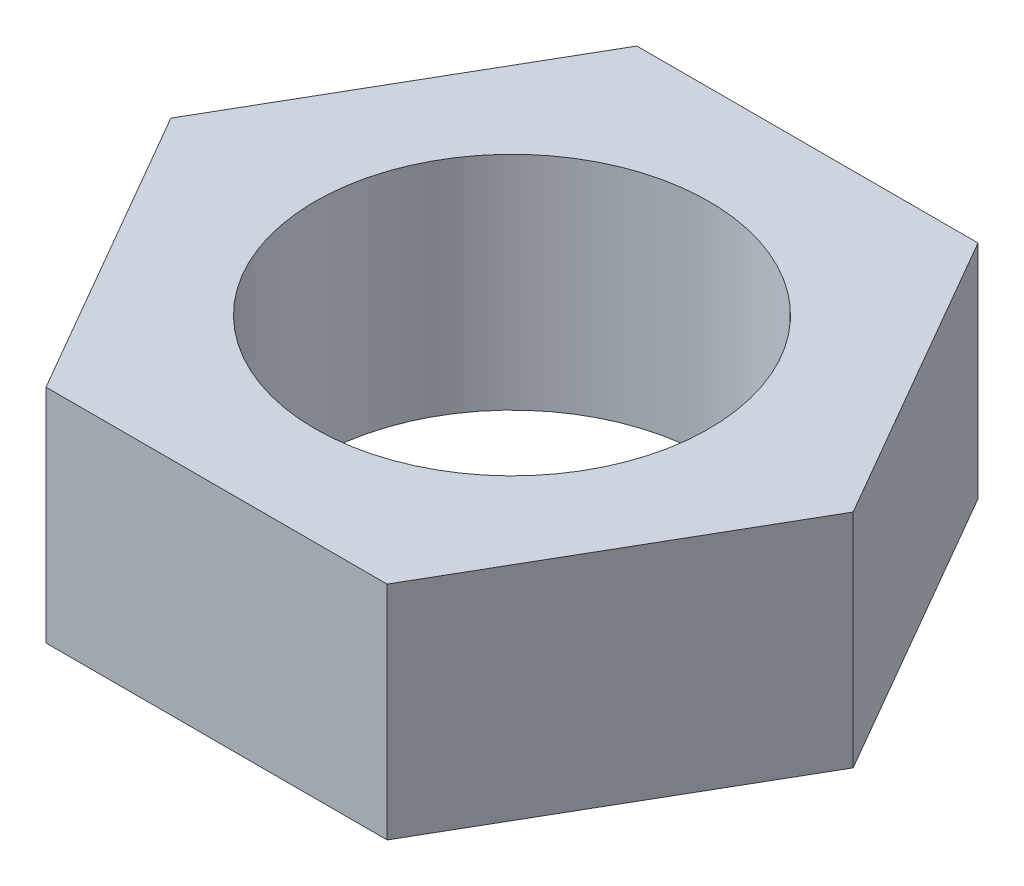
ISO-10303-21;
HEADER;
FILE_DESCRIPTION(('STEP AP214'),'2;1');
FILE_NAME('part.step','',(''),(''),'','','');
FILE_SCHEMA(('AUTOMOTIVE_DESIGN { 1 0 10303 214 1 1 1 1 }'));
ENDSEC;
DATA;
#1=APPLICATION_CONTEXT('core data for automotive mechanical design processes');
#2=APPLICATION_PROTOCOL_DEFINITION('international standard','automotive_design',2000,#1);
#3=PRODUCT_CONTEXT('',#1,'mechanical');
#4=PRODUCT('Part','Part','',(#3));
#5=PRODUCT_RELATED_PRODUCT_CATEGORY('part','',(#4));
#6=PRODUCT_DEFINITION_FORMATION('','',#4);
#7=PRODUCT_DEFINITION_CONTEXT('part definition',#1,'design');
#8=PRODUCT_DEFINITION('design','',#6,#7);
#9=PRODUCT_DEFINITION_SHAPE('','',#8);
#10=(LENGTH_UNIT() NAMED_UNIT(*) SI_UNIT(.MILLI.,.METRE.));
#11=(NAMED_UNIT(*) PLANE_ANGLE_UNIT() SI_UNIT($,.RADIAN.));
#12=(NAMED_UNIT(*) SI_UNIT($,.STERADIAN.) SOLID_ANGLE_UNIT());
#13=UNCERTAINTY_MEASURE_WITH_UNIT(LENGTH_MEASURE(1.E-05),#10,'distance_accuracy_value','');
#14=(GEOMETRIC_REPRESENTATION_CONTEXT(3) GLOBAL_UNCERTAINTY_ASSIGNED_CONTEXT((#13)) GLOBAL_UNIT_ASSIGNED_CONTEXT((#10,
#11,#12)) REPRESENTATION_CONTEXT('',''));
#15=CARTESIAN_POINT('',(0.,0.,0.));
#16=DIRECTION('',(0.,0.,1.));
#17=DIRECTION('',(1.,0.,0.));
#18=AXIS2_PLACEMENT_3D('',#15,#16,#17);
#19=CARTESIAN_POINT('',(16.4977839420936,10.715625,0.));
#20=DIRECTION('',(0.,-1.,0.));
#21=DIRECTION('',(0.,0.,-1.));
#22=AXIS2_PLACEMENT_3D('',#19,#20,#21);
#23=PLANE('',#22);
#24=DIRECTION('',(-0.5,0.,-0.866025403784439));
#25=VECTOR('',#24,1.);
#26=CARTESIAN_POINT('',(16.4977839420936,10.715625,0.));
#27=LINE('',#26,#25);
#28=CARTESIAN_POINT('',(16.4977839420936,10.715625,0.));
#29=VERTEX_POINT('',#28);
#30=CARTESIAN_POINT('',(8.24889197104679,10.715625,-14.2875));
#31=VERTEX_POINT('',#30);
#32=EDGE_CURVE('E128',#29,#31,#27,.T.);
#33=ORIENTED_EDGE('',*,*,#32,.T.);
#34=DIRECTION('',(-1.,0.,0.));
#35=VECTOR('',#34,1.);
#36=CARTESIAN_POINT('',(8.24889197104679,10.715625,-14.2875));
#37=LINE('',#36,#35);
#38=CARTESIAN_POINT('',(-8.24889197104677,10.715625,-14.2875));
#39=VERTEX_POINT('',#38);
#40=EDGE_CURVE('E86',#31,#39,#37,.T.);
#41=ORIENTED_EDGE('',*,*,#40,.T.);
#42=DIRECTION('',(-0.5,0.,0.866025403784439));
#43=VECTOR('',#42,1.);
#44=CARTESIAN_POINT('',(-8.24889197104677,10.715625,-14.2875));
#45=LINE('',#44,#43);
#46=CARTESIAN_POINT('',(-16.4977839420936,10.715625,0.));
#47=VERTEX_POINT('',#46);
#48=EDGE_CURVE('E99',#39,#47,#45,.T.);
#49=ORIENTED_EDGE('',*,*,#48,.T.);
#50=DIRECTION('',(0.5,0.,0.866025403784439));
#51=VECTOR('',#50,1.);
#52=CARTESIAN_POINT('',(-16.4977839420936,10.715625,0.));
#53=LINE('',#52,#51);
#54=CARTESIAN_POINT('',(-8.24889197104677,10.715625,14.2875));
#55=VERTEX_POINT('',#54);
#56=EDGE_CURVE('E93',#47,#55,#53,.T.);
#57=ORIENTED_EDGE('',*,*,#56,.T.);
#58=DIRECTION('',(1.,0.,0.));
#59=VECTOR('',#58,1.);
#60=CARTESIAN_POINT('',(-8.24889197104677,10.715625,14.2875));
#61=LINE('',#60,#59);
#62=CARTESIAN_POINT('',(8.24889197104678,10.715625,14.2875));
#63=VERTEX_POINT('',#62);
#64=EDGE_CURVE('E97',#55,#63,#61,.T.);
#65=ORIENTED_EDGE('',*,*,#64,.T.);
#66=DIRECTION('',(0.5,0.,-0.866025403784438));
#67=VECTOR('',#66,1.);
#68=CARTESIAN_POINT('',(8.24889197104678,10.715625,14.2875));
#69=LINE('',#68,#67);
#70=EDGE_CURVE('E49',#63,#29,#69,.T.);
#71=ORIENTED_EDGE('',*,*,#70,.T.);
#72=EDGE_LOOP('',(#33,#41,#49,#57,#65,#71));
#73=FACE_BOUND('',#72,.T.);
#74=CARTESIAN_POINT('',(0.,10.715625,0.));
#75=DIRECTION('',(0.,1.,0.));
#76=DIRECTION('',(0.,0.,1.));
#77=AXIS2_PLACEMENT_3D('',#74,#75,#76);
#78=CIRCLE('',#77,9.525);
#79=CARTESIAN_POINT('',(0.,10.715625,9.525));
#80=VERTEX_POINT('',#79);
#81=EDGE_CURVE('E121',#80,#80,#78,.T.);
#82=ORIENTED_EDGE('',*,*,#81,.F.);
#83=EDGE_LOOP('',(#82));
#84=FACE_BOUND('',#83,.T.);
#85=ADVANCED_FACE('F32',(#73,#84),#23,.F.);
#86=CARTESIAN_POINT('',(16.4977839420936,0.,0.));
#87=DIRECTION('',(0.,-1.,0.));
#88=DIRECTION('',(0.,0.,-1.));
#89=AXIS2_PLACEMENT_3D('',#86,#87,#88);
#90=PLANE('',#89);
#91=DIRECTION('',(-0.5,0.,-0.866025403784439));
#92=VECTOR('',#91,1.);
#93=CARTESIAN_POINT('',(16.4977839420936,0.,0.));
#94=LINE('',#93,#92);
#95=CARTESIAN_POINT('',(16.4977839420936,0.,0.));
#96=VERTEX_POINT('',#95);
#97=CARTESIAN_POINT('',(8.24889197104679,0.,-14.2875));
#98=VERTEX_POINT('',#97);
#99=EDGE_CURVE('E117',#96,#98,#94,.T.);
#100=ORIENTED_EDGE('',*,*,#99,.F.);
#101=DIRECTION('',(0.5,0.,-0.866025403784438));
#102=VECTOR('',#101,1.);
#103=CARTESIAN_POINT('',(8.24889197104678,0.,14.2875));
#104=LINE('',#103,#102);
#105=CARTESIAN_POINT('',(8.24889197104678,0.,14.2875));
#106=VERTEX_POINT('',#105);
#107=EDGE_CURVE('E78',#106,#96,#104,.T.);
#108=ORIENTED_EDGE('',*,*,#107,.F.);
#109=DIRECTION('',(1.,0.,0.));
#110=VECTOR('',#109,1.);
#111=CARTESIAN_POINT('',(-8.24889197104677,0.,14.2875));
#112=LINE('',#111,#110);
#113=CARTESIAN_POINT('',(-8.24889197104677,0.,14.2875));
#114=VERTEX_POINT('',#113);
#115=EDGE_CURVE('E72',#114,#106,#112,.T.);
#116=ORIENTED_EDGE('',*,*,#115,.F.);
#117=DIRECTION('',(0.5,0.,0.866025403784439));
#118=VECTOR('',#117,1.);
#119=CARTESIAN_POINT('',(-16.4977839420936,0.,0.));
#120=LINE('',#119,#118);
#121=CARTESIAN_POINT('',(-16.4977839420936,0.,0.));
#122=VERTEX_POINT('',#121);
#123=EDGE_CURVE('E107',#122,#114,#120,.T.);
#124=ORIENTED_EDGE('',*,*,#123,.F.);
#125=DIRECTION('',(-0.5,0.,0.866025403784439));
#126=VECTOR('',#125,1.);
#127=CARTESIAN_POINT('',(-8.24889197104677,0.,-14.2875));
#128=LINE('',#127,#126);
#129=CARTESIAN_POINT('',(-8.24889197104677,0.,-14.2875));
#130=VERTEX_POINT('',#129);
#131=EDGE_CURVE('E123',#130,#122,#128,.T.);
#132=ORIENTED_EDGE('',*,*,#131,.F.);
#133=DIRECTION('',(-1.,0.,0.));
#134=VECTOR('',#133,1.);
#135=CARTESIAN_POINT('',(8.24889197104679,0.,-14.2875));
#136=LINE('',#135,#134);
#137=EDGE_CURVE('E120',#98,#130,#136,.T.);
#138=ORIENTED_EDGE('',*,*,#137,.F.);
#139=EDGE_LOOP('',(#100,#108,#116,#124,#132,#138));
#140=FACE_BOUND('',#139,.T.);
#141=CARTESIAN_POINT('',(0.,0.,0.));
#142=DIRECTION('',(0.,1.,0.));
#143=DIRECTION('',(0.,0.,1.));
#144=AXIS2_PLACEMENT_3D('',#141,#142,#143);
#145=CIRCLE('',#144,9.525);
#146=CARTESIAN_POINT('',(0.,0.,9.525));
#147=VERTEX_POINT('',#146);
#148=EDGE_CURVE('E221',#147,#147,#145,.T.);
#149=ORIENTED_EDGE('',*,*,#148,.T.);
#150=EDGE_LOOP('',(#149));
#151=FACE_BOUND('',#150,.T.);
#152=ADVANCED_FACE('F137',(#140,#151),#90,.T.);
#153=CARTESIAN_POINT('',(16.4977839420936,10.715625,0.));
#154=DIRECTION('',(-0.866025403784439,0.,0.5));
#155=DIRECTION('',(0.5,0.,0.866025403784439));
#156=AXIS2_PLACEMENT_3D('',#153,#154,#155);
#157=PLANE('',#156);
#158=ORIENTED_EDGE('',*,*,#99,.T.);
#159=DIRECTION('',(0.,-1.,0.));
#160=VECTOR('',#159,1.);
#161=CARTESIAN_POINT('',(8.24889197104679,10.715625,-14.2875));
#162=LINE('',#161,#160);
#163=EDGE_CURVE('E11',#31,#98,#162,.T.);
#164=ORIENTED_EDGE('',*,*,#163,.F.);
#165=ORIENTED_EDGE('',*,*,#32,.F.);
#166=DIRECTION('',(0.,-1.,0.));
#167=VECTOR('',#166,1.);
#168=CARTESIAN_POINT('',(16.4977839420936,10.715625,0.));
#169=LINE('',#168,#167);
#170=EDGE_CURVE('E113',#29,#96,#169,.T.);
#171=ORIENTED_EDGE('',*,*,#170,.T.);
#172=EDGE_LOOP('',(#158,#164,#165,#171));
#173=FACE_BOUND('',#172,.T.);
#174=ADVANCED_FACE('F34',(#173),#157,.F.);
#175=CARTESIAN_POINT('',(8.24889197104679,10.715625,-14.2875));
#176=DIRECTION('',(0.,0.,1.));
#177=DIRECTION('',(1.,0.,0.));
#178=AXIS2_PLACEMENT_3D('',#175,#176,#177);
#179=PLANE('',#178);
#180=ORIENTED_EDGE('',*,*,#137,.T.);
#181=DIRECTION('',(0.,-1.,0.));
#182=VECTOR('',#181,1.);
#183=CARTESIAN_POINT('',(-8.24889197104677,10.715625,-14.2875));
#184=LINE('',#183,#182);
#185=EDGE_CURVE('E41',#39,#130,#184,.T.);
#186=ORIENTED_EDGE('',*,*,#185,.F.);
#187=ORIENTED_EDGE('',*,*,#40,.F.);
#188=ORIENTED_EDGE('',*,*,#163,.T.);
#189=EDGE_LOOP('',(#180,#186,#187,#188));
#190=FACE_BOUND('',#189,.T.);
#191=ADVANCED_FACE('F162',(#190),#179,.F.);
#192=CARTESIAN_POINT('',(-8.24889197104677,10.715625,-14.2875));
#193=DIRECTION('',(0.866025403784439,0.,0.5));
#194=DIRECTION('',(0.5,0.,-0.866025403784439));
#195=AXIS2_PLACEMENT_3D('',#192,#193,#194);
#196=PLANE('',#195);
#197=ORIENTED_EDGE('',*,*,#131,.T.);
#198=DIRECTION('',(0.,-1.,0.));
#199=VECTOR('',#198,1.);
#200=CARTESIAN_POINT('',(-16.4977839420936,10.715625,0.));
#201=LINE('',#200,#199);
#202=EDGE_CURVE('E108',#47,#122,#201,.T.);
#203=ORIENTED_EDGE('',*,*,#202,.F.);
#204=ORIENTED_EDGE('',*,*,#48,.F.);
#205=ORIENTED_EDGE('',*,*,#185,.T.);
#206=EDGE_LOOP('',(#197,#203,#204,#205));
#207=FACE_BOUND('',#206,.T.);
#208=ADVANCED_FACE('F134',(#207),#196,.F.);
#209=CARTESIAN_POINT('',(-16.4977839420936,10.715625,0.));
#210=DIRECTION('',(0.866025403784439,0.,-0.5));
#211=DIRECTION('',(-0.5,0.,-0.866025403784439));
#212=AXIS2_PLACEMENT_3D('',#209,#210,#211);
#213=PLANE('',#212);
#214=ORIENTED_EDGE('',*,*,#123,.T.);
#215=DIRECTION('',(0.,-1.,0.));
#216=VECTOR('',#215,1.);
#217=CARTESIAN_POINT('',(-8.24889197104677,10.715625,14.2875));
#218=LINE('',#217,#216);
#219=EDGE_CURVE('E104',#55,#114,#218,.T.);
#220=ORIENTED_EDGE('',*,*,#219,.F.);
#221=ORIENTED_EDGE('',*,*,#56,.F.);
#222=ORIENTED_EDGE('',*,*,#202,.T.);
#223=EDGE_LOOP('',(#214,#220,#221,#222));
#224=FACE_BOUND('',#223,.T.);
#225=ADVANCED_FACE('F105',(#224),#213,.F.);
#226=CARTESIAN_POINT('',(-8.24889197104677,10.715625,14.2875));
#227=DIRECTION('',(0.,0.,-1.));
#228=DIRECTION('',(-1.,0.,0.));
#229=AXIS2_PLACEMENT_3D('',#226,#227,#228);
#230=PLANE('',#229);
#231=ORIENTED_EDGE('',*,*,#115,.T.);
#232=DIRECTION('',(0.,-1.,0.));
#233=VECTOR('',#232,1.);
#234=CARTESIAN_POINT('',(8.24889197104678,10.715625,14.2875));
#235=LINE('',#234,#233);
#236=EDGE_CURVE('E109',#63,#106,#235,.T.);
#237=ORIENTED_EDGE('',*,*,#236,.F.);
#238=ORIENTED_EDGE('',*,*,#64,.F.);
#239=ORIENTED_EDGE('',*,*,#219,.T.);
#240=EDGE_LOOP('',(#231,#237,#238,#239));
#241=FACE_BOUND('',#240,.T.);
#242=ADVANCED_FACE('F111',(#241),#230,.F.);
#243=CARTESIAN_POINT('',(8.24889197104678,10.715625,14.2875));
#244=DIRECTION('',(-0.866025403784439,0.,-0.5));
#245=DIRECTION('',(-0.5,0.,0.866025403784439));
#246=AXIS2_PLACEMENT_3D('',#243,#244,#245);
#247=PLANE('',#246);
#248=ORIENTED_EDGE('',*,*,#107,.T.);
#249=ORIENTED_EDGE('',*,*,#170,.F.);
#250=ORIENTED_EDGE('',*,*,#70,.F.);
#251=ORIENTED_EDGE('',*,*,#236,.T.);
#252=EDGE_LOOP('',(#248,#249,#250,#251));
#253=FACE_BOUND('',#252,.T.);
#254=ADVANCED_FACE('F142',(#253),#247,.F.);
#255=CARTESIAN_POINT('',(0.,10.715625,0.));
#256=DIRECTION('',(0.,-1.,0.));
#257=DIRECTION('',(0.,0.,-1.));
#258=AXIS2_PLACEMENT_3D('',#255,#256,#257);
#259=CYLINDRICAL_SURFACE('',#258,9.525);
#260=ORIENTED_EDGE('',*,*,#81,.T.);
#261=EDGE_LOOP('',(#260));
#262=FACE_BOUND('',#261,.T.);
#263=ORIENTED_EDGE('',*,*,#148,.F.);
#264=EDGE_LOOP('',(#263));
#265=FACE_BOUND('',#264,.T.);
#266=ADVANCED_FACE('F144',(#262,#265),#259,.F.);
#267=CLOSED_SHELL('',(#85,#152,#174,#191,#208,#225,#242,#254,#266));
#268=MANIFOLD_SOLID_BREP('B2',#267);
#269=ADVANCED_BREP_SHAPE_REPRESENTATION('',(#18,#268),#14);
#270=SHAPE_DEFINITION_REPRESENTATION(#9,#269);
ENDSEC;
END-ISO-10303-21;
